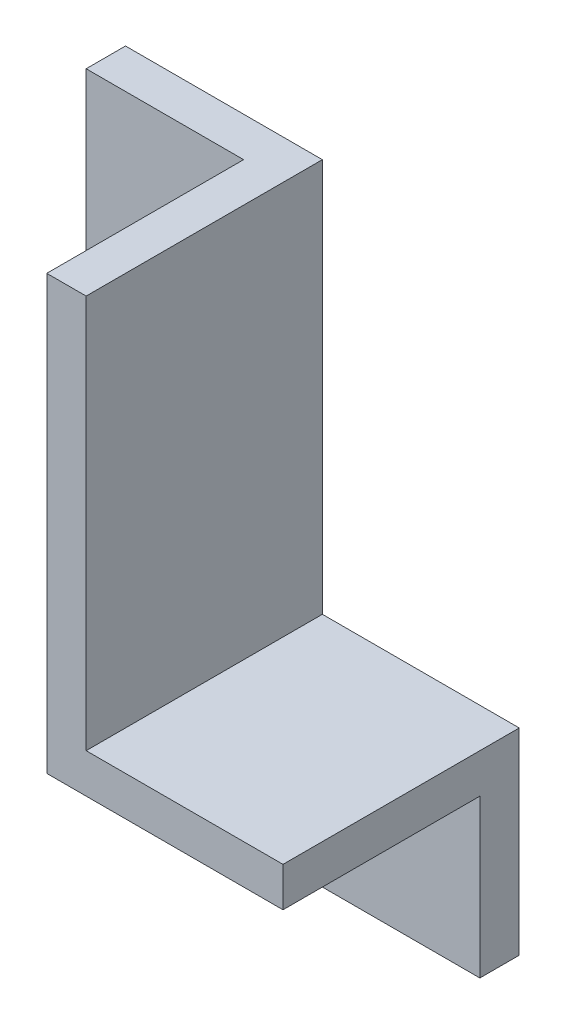
ISO-10303-21;
HEADER;
FILE_DESCRIPTION(('STEP AP214'),'2;1');
FILE_NAME('part.step','',(''),(''),'','','');
FILE_SCHEMA(('AUTOMOTIVE_DESIGN { 1 0 10303 214 1 1 1 1 }'));
ENDSEC;
DATA;
#1=APPLICATION_CONTEXT('core data for automotive mechanical design processes');
#2=APPLICATION_PROTOCOL_DEFINITION('international standard','automotive_design',2000,#1);
#3=PRODUCT_CONTEXT('',#1,'mechanical');
#4=PRODUCT('Part','Part','',(#3));
#5=PRODUCT_RELATED_PRODUCT_CATEGORY('part','',(#4));
#6=PRODUCT_DEFINITION_FORMATION('','',#4);
#7=PRODUCT_DEFINITION_CONTEXT('part definition',#1,'design');
#8=PRODUCT_DEFINITION('design','',#6,#7);
#9=PRODUCT_DEFINITION_SHAPE('','',#8);
#10=(LENGTH_UNIT() NAMED_UNIT(*) SI_UNIT(.MILLI.,.METRE.));
#11=(NAMED_UNIT(*) PLANE_ANGLE_UNIT() SI_UNIT($,.RADIAN.));
#12=(NAMED_UNIT(*) SI_UNIT($,.STERADIAN.) SOLID_ANGLE_UNIT());
#13=UNCERTAINTY_MEASURE_WITH_UNIT(LENGTH_MEASURE(1.E-05),#10,'distance_accuracy_value','');
#14=(GEOMETRIC_REPRESENTATION_CONTEXT(3) GLOBAL_UNCERTAINTY_ASSIGNED_CONTEXT((#13)) GLOBAL_UNIT_ASSIGNED_CONTEXT((#10,
#11,#12)) REPRESENTATION_CONTEXT('',''));
#15=CARTESIAN_POINT('',(0.,0.,0.));
#16=DIRECTION('',(0.,0.,1.));
#17=DIRECTION('',(1.,0.,0.));
#18=AXIS2_PLACEMENT_3D('',#15,#16,#17);
#19=CARTESIAN_POINT('',(0.,0.,10.));
#20=DIRECTION('',(0.,0.,-1.));
#21=DIRECTION('',(-1.,0.,0.));
#22=AXIS2_PLACEMENT_3D('',#19,#20,#21);
#23=PLANE('',#22);
#24=CARTESIAN_POINT('',(25.4168295578283,24.2429700723395,10.));
#25=DIRECTION('',(0.,0.,1.));
#26=DIRECTION('',(1.,0.,0.));
#27=AXIS2_PLACEMENT_3D('',#24,#25,#26);
#28=CIRCLE('',#27,6.19125);
#29=CARTESIAN_POINT('',(31.6080795578283,24.2429700723395,10.));
#30=VERTEX_POINT('',#29);
#31=EDGE_CURVE('E365',#30,#30,#28,.T.);
#32=ORIENTED_EDGE('',*,*,#31,.F.);
#33=EDGE_LOOP('',(#32));
#34=FACE_BOUND('',#33,.T.);
#35=DIRECTION('',(1.,0.,0.));
#36=VECTOR('',#35,1.);
#37=CARTESIAN_POINT('',(40.,40.,10.));
#38=LINE('',#37,#36);
#39=CARTESIAN_POINT('',(40.,40.,10.));
#40=VERTEX_POINT('',#39);
#41=CARTESIAN_POINT('',(100.,40.,10.));
#42=VERTEX_POINT('',#41);
#43=EDGE_CURVE('E125',#40,#42,#38,.T.);
#44=ORIENTED_EDGE('',*,*,#43,.F.);
#45=DIRECTION('',(0.,-1.,0.));
#46=VECTOR('',#45,1.);
#47=CARTESIAN_POINT('',(40.,150.,10.));
#48=LINE('',#47,#46);
#49=CARTESIAN_POINT('',(40.,150.,10.));
#50=VERTEX_POINT('',#49);
#51=EDGE_CURVE('E50',#50,#40,#48,.T.);
#52=ORIENTED_EDGE('',*,*,#51,.F.);
#53=DIRECTION('',(-1.,0.,0.));
#54=VECTOR('',#53,1.);
#55=CARTESIAN_POINT('',(0.,150.,10.));
#56=LINE('',#55,#54);
#57=CARTESIAN_POINT('',(0.,150.,10.));
#58=VERTEX_POINT('',#57);
#59=EDGE_CURVE('E129',#50,#58,#56,.T.);
#60=ORIENTED_EDGE('',*,*,#59,.T.);
#61=DIRECTION('',(0.,-1.,0.));
#62=VECTOR('',#61,1.);
#63=CARTESIAN_POINT('',(0.,0.,10.));
#64=LINE('',#63,#62);
#65=CARTESIAN_POINT('',(0.,0.,10.));
#66=VERTEX_POINT('',#65);
#67=EDGE_CURVE('E148',#58,#66,#64,.T.);
#68=ORIENTED_EDGE('',*,*,#67,.T.);
#69=DIRECTION('',(1.,0.,0.));
#70=VECTOR('',#69,1.);
#71=CARTESIAN_POINT('',(0.,0.,10.));
#72=LINE('',#71,#70);
#73=CARTESIAN_POINT('',(100.,0.,10.));
#74=VERTEX_POINT('',#73);
#75=EDGE_CURVE('E151',#66,#74,#72,.T.);
#76=ORIENTED_EDGE('',*,*,#75,.T.);
#77=DIRECTION('',(0.,1.,0.));
#78=VECTOR('',#77,1.);
#79=CARTESIAN_POINT('',(100.,50.,10.));
#80=LINE('',#79,#78);
#81=EDGE_CURVE('E56',#74,#42,#80,.T.);
#82=ORIENTED_EDGE('',*,*,#81,.T.);
#83=EDGE_LOOP('',(#44,#52,#60,#68,#76,#82));
#84=FACE_BOUND('',#83,.T.);
#85=ADVANCED_FACE('F33',(#34,#84),#23,.F.);
#86=CARTESIAN_POINT('',(0.,0.,10.));
#87=DIRECTION('',(1.,0.,0.));
#88=DIRECTION('',(0.,0.,-1.));
#89=AXIS2_PLACEMENT_3D('',#86,#87,#88);
#90=PLANE('',#89);
#91=DIRECTION('',(0.,-1.,0.));
#92=VECTOR('',#91,1.);
#93=CARTESIAN_POINT('',(0.,0.,0.));
#94=LINE('',#93,#92);
#95=CARTESIAN_POINT('',(0.,150.,0.));
#96=VERTEX_POINT('',#95);
#97=CARTESIAN_POINT('',(0.,0.,0.));
#98=VERTEX_POINT('',#97);
#99=EDGE_CURVE('E130',#96,#98,#94,.T.);
#100=ORIENTED_EDGE('',*,*,#99,.T.);
#101=DIRECTION('',(0.,0.,-1.));
#102=VECTOR('',#101,1.);
#103=CARTESIAN_POINT('',(0.,0.,10.));
#104=LINE('',#103,#102);
#105=EDGE_CURVE('E11',#66,#98,#104,.T.);
#106=ORIENTED_EDGE('',*,*,#105,.F.);
#107=ORIENTED_EDGE('',*,*,#67,.F.);
#108=DIRECTION('',(0.,0.,-1.));
#109=VECTOR('',#108,1.);
#110=CARTESIAN_POINT('',(0.,150.,10.));
#111=LINE('',#110,#109);
#112=EDGE_CURVE('E160',#58,#96,#111,.T.);
#113=ORIENTED_EDGE('',*,*,#112,.T.);
#114=EDGE_LOOP('',(#100,#106,#107,#113));
#115=FACE_BOUND('',#114,.T.);
#116=ADVANCED_FACE('F35',(#115),#90,.F.);
#117=CARTESIAN_POINT('',(0.,0.,10.));
#118=DIRECTION('',(0.,1.,0.));
#119=DIRECTION('',(0.,0.,1.));
#120=AXIS2_PLACEMENT_3D('',#117,#118,#119);
#121=PLANE('',#120);
#122=DIRECTION('',(1.,0.,0.));
#123=VECTOR('',#122,1.);
#124=CARTESIAN_POINT('',(0.,0.,0.));
#125=LINE('',#124,#123);
#126=CARTESIAN_POINT('',(100.,0.,0.));
#127=VERTEX_POINT('',#126);
#128=EDGE_CURVE('E133',#98,#127,#125,.T.);
#129=ORIENTED_EDGE('',*,*,#128,.T.);
#130=DIRECTION('',(0.,0.,-1.));
#131=VECTOR('',#130,1.);
#132=CARTESIAN_POINT('',(100.,0.,10.));
#133=LINE('',#132,#131);
#134=EDGE_CURVE('E42',#74,#127,#133,.T.);
#135=ORIENTED_EDGE('',*,*,#134,.F.);
#136=ORIENTED_EDGE('',*,*,#75,.F.);
#137=ORIENTED_EDGE('',*,*,#105,.T.);
#138=EDGE_LOOP('',(#129,#135,#136,#137));
#139=FACE_BOUND('',#138,.T.);
#140=ADVANCED_FACE('F193',(#139),#121,.F.);
#141=CARTESIAN_POINT('',(100.,50.,10.));
#142=DIRECTION('',(-1.,0.,0.));
#143=DIRECTION('',(0.,0.,1.));
#144=AXIS2_PLACEMENT_3D('',#141,#142,#143);
#145=PLANE('',#144);
#146=DIRECTION('',(0.,1.,0.));
#147=VECTOR('',#146,1.);
#148=CARTESIAN_POINT('',(100.,50.,0.));
#149=LINE('',#148,#147);
#150=CARTESIAN_POINT('',(100.,50.,0.));
#151=VERTEX_POINT('',#150);
#152=EDGE_CURVE('E221',#127,#151,#149,.T.);
#153=ORIENTED_EDGE('',*,*,#152,.T.);
#154=DIRECTION('',(0.,0.,-1.));
#155=VECTOR('',#154,1.);
#156=CARTESIAN_POINT('',(100.,50.,10.));
#157=LINE('',#156,#155);
#158=CARTESIAN_POINT('',(100.,50.,60.));
#159=VERTEX_POINT('',#158);
#160=EDGE_CURVE('E224',#159,#151,#157,.T.);
#161=ORIENTED_EDGE('',*,*,#160,.F.);
#162=DIRECTION('',(0.,1.,0.));
#163=VECTOR('',#162,1.);
#164=CARTESIAN_POINT('',(100.,40.,60.));
#165=LINE('',#164,#163);
#166=CARTESIAN_POINT('',(100.,40.,60.));
#167=VERTEX_POINT('',#166);
#168=EDGE_CURVE('E173',#167,#159,#165,.T.);
#169=ORIENTED_EDGE('',*,*,#168,.F.);
#170=DIRECTION('',(0.,0.,-1.));
#171=VECTOR('',#170,1.);
#172=CARTESIAN_POINT('',(100.,40.,60.));
#173=LINE('',#172,#171);
#174=EDGE_CURVE('E135',#167,#42,#173,.T.);
#175=ORIENTED_EDGE('',*,*,#174,.T.);
#176=ORIENTED_EDGE('',*,*,#81,.F.);
#177=ORIENTED_EDGE('',*,*,#134,.T.);
#178=EDGE_LOOP('',(#153,#161,#169,#175,#176,#177));
#179=FACE_BOUND('',#178,.T.);
#180=ADVANCED_FACE('F181',(#179),#145,.F.);
#181=CARTESIAN_POINT('',(50.,50.,10.));
#182=DIRECTION('',(0.,-1.,0.));
#183=DIRECTION('',(0.,0.,-1.));
#184=AXIS2_PLACEMENT_3D('',#181,#182,#183);
#185=PLANE('',#184);
#186=DIRECTION('',(-1.,0.,0.));
#187=VECTOR('',#186,1.);
#188=CARTESIAN_POINT('',(50.,50.,0.));
#189=LINE('',#188,#187);
#190=CARTESIAN_POINT('',(50.,50.,0.));
#191=VERTEX_POINT('',#190);
#192=EDGE_CURVE('E227',#151,#191,#189,.T.);
#193=ORIENTED_EDGE('',*,*,#192,.T.);
#194=DIRECTION('',(0.,0.,-1.));
#195=VECTOR('',#194,1.);
#196=CARTESIAN_POINT('',(50.,50.,10.));
#197=LINE('',#196,#195);
#198=CARTESIAN_POINT('',(50.,50.,60.));
#199=VERTEX_POINT('',#198);
#200=EDGE_CURVE('E238',#199,#191,#197,.T.);
#201=ORIENTED_EDGE('',*,*,#200,.F.);
#202=DIRECTION('',(-1.,0.,0.));
#203=VECTOR('',#202,1.);
#204=CARTESIAN_POINT('',(100.,50.,60.));
#205=LINE('',#204,#203);
#206=EDGE_CURVE('E175',#159,#199,#205,.T.);
#207=ORIENTED_EDGE('',*,*,#206,.F.);
#208=ORIENTED_EDGE('',*,*,#160,.T.);
#209=EDGE_LOOP('',(#193,#201,#207,#208));
#210=FACE_BOUND('',#209,.T.);
#211=ADVANCED_FACE('F206',(#210),#185,.F.);
#212=CARTESIAN_POINT('',(50.,150.,10.));
#213=DIRECTION('',(-1.,0.,0.));
#214=DIRECTION('',(0.,0.,1.));
#215=AXIS2_PLACEMENT_3D('',#212,#213,#214);
#216=PLANE('',#215);
#217=DIRECTION('',(0.,1.,0.));
#218=VECTOR('',#217,1.);
#219=CARTESIAN_POINT('',(50.,150.,0.));
#220=LINE('',#219,#218);
#221=CARTESIAN_POINT('',(50.,150.,0.));
#222=VERTEX_POINT('',#221);
#223=EDGE_CURVE('E229',#191,#222,#220,.T.);
#224=ORIENTED_EDGE('',*,*,#223,.T.);
#225=DIRECTION('',(0.,0.,-1.));
#226=VECTOR('',#225,1.);
#227=CARTESIAN_POINT('',(50.,150.,10.));
#228=LINE('',#227,#226);
#229=CARTESIAN_POINT('',(50.,150.,60.));
#230=VERTEX_POINT('',#229);
#231=EDGE_CURVE('E236',#230,#222,#228,.T.);
#232=ORIENTED_EDGE('',*,*,#231,.F.);
#233=DIRECTION('',(0.,1.,0.));
#234=VECTOR('',#233,1.);
#235=CARTESIAN_POINT('',(50.,50.,60.));
#236=LINE('',#235,#234);
#237=EDGE_CURVE('E122',#199,#230,#236,.T.);
#238=ORIENTED_EDGE('',*,*,#237,.F.);
#239=ORIENTED_EDGE('',*,*,#200,.T.);
#240=EDGE_LOOP('',(#224,#232,#238,#239));
#241=FACE_BOUND('',#240,.T.);
#242=ADVANCED_FACE('F203',(#241),#216,.F.);
#243=CARTESIAN_POINT('',(0.,150.,10.));
#244=DIRECTION('',(0.,-1.,0.));
#245=DIRECTION('',(0.,0.,-1.));
#246=AXIS2_PLACEMENT_3D('',#243,#244,#245);
#247=PLANE('',#246);
#248=DIRECTION('',(-1.,0.,0.));
#249=VECTOR('',#248,1.);
#250=CARTESIAN_POINT('',(0.,150.,0.));
#251=LINE('',#250,#249);
#252=EDGE_CURVE('E152',#222,#96,#251,.T.);
#253=ORIENTED_EDGE('',*,*,#252,.T.);
#254=ORIENTED_EDGE('',*,*,#112,.F.);
#255=ORIENTED_EDGE('',*,*,#59,.F.);
#256=DIRECTION('',(0.,0.,-1.));
#257=VECTOR('',#256,1.);
#258=CARTESIAN_POINT('',(40.,150.,60.));
#259=LINE('',#258,#257);
#260=CARTESIAN_POINT('',(40.,150.,60.));
#261=VERTEX_POINT('',#260);
#262=EDGE_CURVE('E109',#261,#50,#259,.T.);
#263=ORIENTED_EDGE('',*,*,#262,.F.);
#264=DIRECTION('',(-1.,0.,0.));
#265=VECTOR('',#264,1.);
#266=CARTESIAN_POINT('',(50.,150.,60.));
#267=LINE('',#266,#265);
#268=EDGE_CURVE('E115',#230,#261,#267,.T.);
#269=ORIENTED_EDGE('',*,*,#268,.F.);
#270=ORIENTED_EDGE('',*,*,#231,.T.);
#271=EDGE_LOOP('',(#253,#254,#255,#263,#269,#270));
#272=FACE_BOUND('',#271,.T.);
#273=ADVANCED_FACE('F127',(#272),#247,.F.);
#274=CARTESIAN_POINT('',(0.,0.,0.));
#275=DIRECTION('',(0.,0.,-1.));
#276=DIRECTION('',(-1.,0.,0.));
#277=AXIS2_PLACEMENT_3D('',#274,#275,#276);
#278=PLANE('',#277);
#279=CARTESIAN_POINT('',(25.4168295578283,24.2429700723395,0.));
#280=DIRECTION('',(0.,0.,1.));
#281=DIRECTION('',(1.,0.,0.));
#282=AXIS2_PLACEMENT_3D('',#279,#280,#281);
#283=CIRCLE('',#282,2.55270000000001);
#284=CARTESIAN_POINT('',(27.9695295578283,24.2429700723395,0.));
#285=VERTEX_POINT('',#284);
#286=EDGE_CURVE('E161',#285,#285,#283,.T.);
#287=ORIENTED_EDGE('',*,*,#286,.T.);
#288=EDGE_LOOP('',(#287));
#289=FACE_BOUND('',#288,.T.);
#290=ORIENTED_EDGE('',*,*,#99,.F.);
#291=ORIENTED_EDGE('',*,*,#252,.F.);
#292=ORIENTED_EDGE('',*,*,#223,.F.);
#293=ORIENTED_EDGE('',*,*,#192,.F.);
#294=ORIENTED_EDGE('',*,*,#152,.F.);
#295=ORIENTED_EDGE('',*,*,#128,.F.);
#296=EDGE_LOOP('',(#290,#291,#292,#293,#294,#295));
#297=FACE_BOUND('',#296,.T.);
#298=ADVANCED_FACE('F199',(#289,#297),#278,.T.);
#299=CARTESIAN_POINT('',(40.,150.,60.));
#300=DIRECTION('',(1.,0.,0.));
#301=DIRECTION('',(0.,1.,0.));
#302=AXIS2_PLACEMENT_3D('',#299,#300,#301);
#303=PLANE('',#302);
#304=ORIENTED_EDGE('',*,*,#51,.T.);
#305=DIRECTION('',(0.,0.,-1.));
#306=VECTOR('',#305,1.);
#307=CARTESIAN_POINT('',(40.,40.,60.));
#308=LINE('',#307,#306);
#309=CARTESIAN_POINT('',(40.,40.,60.));
#310=VERTEX_POINT('',#309);
#311=EDGE_CURVE('E111',#310,#40,#308,.T.);
#312=ORIENTED_EDGE('',*,*,#311,.F.);
#313=DIRECTION('',(0.,-1.,0.));
#314=VECTOR('',#313,1.);
#315=CARTESIAN_POINT('',(40.,150.,60.));
#316=LINE('',#315,#314);
#317=EDGE_CURVE('E105',#261,#310,#316,.T.);
#318=ORIENTED_EDGE('',*,*,#317,.F.);
#319=ORIENTED_EDGE('',*,*,#262,.T.);
#320=EDGE_LOOP('',(#304,#312,#318,#319));
#321=FACE_BOUND('',#320,.T.);
#322=ADVANCED_FACE('F107',(#321),#303,.F.);
#323=CARTESIAN_POINT('',(40.,40.,60.));
#324=DIRECTION('',(0.,1.,0.));
#325=DIRECTION('',(0.,0.,1.));
#326=AXIS2_PLACEMENT_3D('',#323,#324,#325);
#327=PLANE('',#326);
#328=ORIENTED_EDGE('',*,*,#43,.T.);
#329=ORIENTED_EDGE('',*,*,#174,.F.);
#330=DIRECTION('',(1.,0.,0.));
#331=VECTOR('',#330,1.);
#332=CARTESIAN_POINT('',(40.,40.,60.));
#333=LINE('',#332,#331);
#334=EDGE_CURVE('E114',#310,#167,#333,.T.);
#335=ORIENTED_EDGE('',*,*,#334,.F.);
#336=ORIENTED_EDGE('',*,*,#311,.T.);
#337=EDGE_LOOP('',(#328,#329,#335,#336));
#338=FACE_BOUND('',#337,.T.);
#339=ADVANCED_FACE('F184',(#338),#327,.F.);
#340=CARTESIAN_POINT('',(0.,0.,60.));
#341=DIRECTION('',(0.,0.,1.));
#342=DIRECTION('',(1.,0.,0.));
#343=AXIS2_PLACEMENT_3D('',#340,#341,#342);
#344=PLANE('',#343);
#345=ORIENTED_EDGE('',*,*,#268,.T.);
#346=ORIENTED_EDGE('',*,*,#317,.T.);
#347=ORIENTED_EDGE('',*,*,#334,.T.);
#348=ORIENTED_EDGE('',*,*,#168,.T.);
#349=ORIENTED_EDGE('',*,*,#206,.T.);
#350=ORIENTED_EDGE('',*,*,#237,.T.);
#351=EDGE_LOOP('',(#345,#346,#347,#348,#349,#350));
#352=FACE_BOUND('',#351,.T.);
#353=ADVANCED_FACE('F119',(#352),#344,.T.);
#354=CARTESIAN_POINT('',(25.4168295578283,24.2429700723395,10.));
#355=DIRECTION('',(0.,0.,1.));
#356=DIRECTION('',(1.,0.,0.));
#357=AXIS2_PLACEMENT_3D('',#354,#355,#356);
#358=CYLINDRICAL_SURFACE('',#357,2.5527);
#359=ORIENTED_EDGE('',*,*,#286,.F.);
#360=EDGE_LOOP('',(#359));
#361=FACE_BOUND('',#360,.T.);
#362=CARTESIAN_POINT('',(25.4168295578283,24.2429700723395,6.8758));
#363=DIRECTION('',(0.,0.,1.));
#364=DIRECTION('',(1.,0.,0.));
#365=AXIS2_PLACEMENT_3D('',#362,#363,#364);
#366=CIRCLE('',#365,2.5527);
#367=CARTESIAN_POINT('',(27.9695295578283,24.2429700723395,6.8758));
#368=VERTEX_POINT('',#367);
#369=EDGE_CURVE('E163',#368,#368,#366,.T.);
#370=ORIENTED_EDGE('',*,*,#369,.T.);
#371=EDGE_LOOP('',(#370));
#372=FACE_BOUND('',#371,.T.);
#373=ADVANCED_FACE('F285',(#361,#372),#358,.F.);
#374=CARTESIAN_POINT('',(30.9730795578283,24.2429700723395,6.8758));
#375=DIRECTION('',(0.,0.,-1.));
#376=DIRECTION('',(-1.,0.,0.));
#377=AXIS2_PLACEMENT_3D('',#374,#375,#376);
#378=PLANE('',#377);
#379=ORIENTED_EDGE('',*,*,#369,.F.);
#380=EDGE_LOOP('',(#379));
#381=FACE_BOUND('',#380,.T.);
#382=CARTESIAN_POINT('',(25.4168295578283,24.2429700723395,6.8758));
#383=DIRECTION('',(0.,0.,1.));
#384=DIRECTION('',(1.,0.,0.));
#385=AXIS2_PLACEMENT_3D('',#382,#383,#384);
#386=CIRCLE('',#385,5.55625);
#387=CARTESIAN_POINT('',(30.9730795578283,24.2429700723395,6.8758));
#388=VERTEX_POINT('',#387);
#389=EDGE_CURVE('E168',#388,#388,#386,.T.);
#390=ORIENTED_EDGE('',*,*,#389,.T.);
#391=EDGE_LOOP('',(#390));
#392=FACE_BOUND('',#391,.T.);
#393=ADVANCED_FACE('F291',(#381,#392),#378,.F.);
#394=CARTESIAN_POINT('',(25.4168295578283,24.2429700723395,10.));
#395=DIRECTION('',(0.,0.,1.));
#396=DIRECTION('',(1.,0.,0.));
#397=AXIS2_PLACEMENT_3D('',#394,#395,#396);
#398=CYLINDRICAL_SURFACE('',#397,5.55625);
#399=ORIENTED_EDGE('',*,*,#389,.F.);
#400=EDGE_LOOP('',(#399));
#401=FACE_BOUND('',#400,.T.);
#402=CARTESIAN_POINT('',(25.4168295578283,24.2429700723395,9.365));
#403=DIRECTION('',(0.,0.,1.));
#404=DIRECTION('',(1.,0.,0.));
#405=AXIS2_PLACEMENT_3D('',#402,#403,#404);
#406=CIRCLE('',#405,5.55625);
#407=CARTESIAN_POINT('',(30.9730795578283,24.2429700723395,9.365));
#408=VERTEX_POINT('',#407);
#409=EDGE_CURVE('E363',#408,#408,#406,.T.);
#410=ORIENTED_EDGE('',*,*,#409,.T.);
#411=EDGE_LOOP('',(#410));
#412=FACE_BOUND('',#411,.T.);
#413=ADVANCED_FACE('F299',(#401,#412),#398,.F.);
#414=CARTESIAN_POINT('',(25.4168295578283,24.2429700723395,10.));
#415=DIRECTION('',(0.,0.,1.));
#416=DIRECTION('',(1.,0.,0.));
#417=AXIS2_PLACEMENT_3D('',#414,#415,#416);
#418=CONICAL_SURFACE('',#417,6.19125,0.785398163397443);
#419=ORIENTED_EDGE('',*,*,#409,.F.);
#420=EDGE_LOOP('',(#419));
#421=FACE_BOUND('',#420,.T.);
#422=ORIENTED_EDGE('',*,*,#31,.T.);
#423=EDGE_LOOP('',(#422));
#424=FACE_BOUND('',#423,.T.);
#425=ADVANCED_FACE('F307',(#421,#424),#418,.F.);
#426=CLOSED_SHELL('',(#85,#116,#140,#180,#211,#242,#273,#298,#322,#339,#353,#373,#393,#413,#425));
#427=MANIFOLD_SOLID_BREP('B2',#426);
#428=ADVANCED_BREP_SHAPE_REPRESENTATION('',(#18,#427),#14);
#429=SHAPE_DEFINITION_REPRESENTATION(#9,#428);
ENDSEC;
END-ISO-10303-21;
